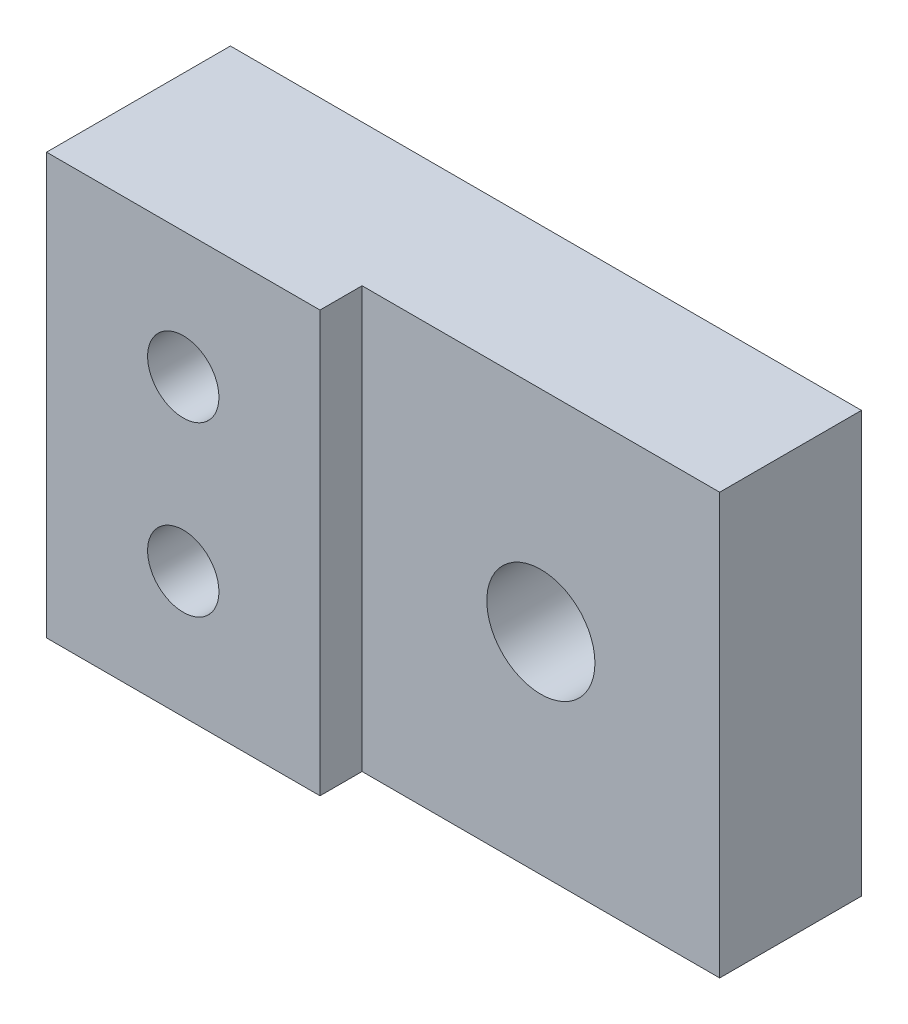
ISO-10303-21;
HEADER;
FILE_DESCRIPTION(('STEP AP214'),'2;1');
FILE_NAME('part.step','',(''),(''),'','','');
FILE_SCHEMA(('AUTOMOTIVE_DESIGN { 1 0 10303 214 1 1 1 1 }'));
ENDSEC;
DATA;
#1=APPLICATION_CONTEXT('core data for automotive mechanical design processes');
#2=APPLICATION_PROTOCOL_DEFINITION('international standard','automotive_design',2000,#1);
#3=PRODUCT_CONTEXT('',#1,'mechanical');
#4=PRODUCT('Part','Part','',(#3));
#5=PRODUCT_RELATED_PRODUCT_CATEGORY('part','',(#4));
#6=PRODUCT_DEFINITION_FORMATION('','',#4);
#7=PRODUCT_DEFINITION_CONTEXT('part definition',#1,'design');
#8=PRODUCT_DEFINITION('design','',#6,#7);
#9=PRODUCT_DEFINITION_SHAPE('','',#8);
#10=(LENGTH_UNIT() NAMED_UNIT(*) SI_UNIT(.MILLI.,.METRE.));
#11=(NAMED_UNIT(*) PLANE_ANGLE_UNIT() SI_UNIT($,.RADIAN.));
#12=(NAMED_UNIT(*) SI_UNIT($,.STERADIAN.) SOLID_ANGLE_UNIT());
#13=UNCERTAINTY_MEASURE_WITH_UNIT(LENGTH_MEASURE(1.E-05),#10,'distance_accuracy_value','');
#14=(GEOMETRIC_REPRESENTATION_CONTEXT(3) GLOBAL_UNCERTAINTY_ASSIGNED_CONTEXT((#13)) GLOBAL_UNIT_ASSIGNED_CONTEXT((#10,
#11,#12)) REPRESENTATION_CONTEXT('',''));
#15=CARTESIAN_POINT('',(0.,0.,0.));
#16=DIRECTION('',(0.,0.,1.));
#17=DIRECTION('',(1.,0.,0.));
#18=AXIS2_PLACEMENT_3D('',#15,#16,#17);
#19=CARTESIAN_POINT('',(0.,26.1112,11.0998));
#20=DIRECTION('',(0.,1.,0.));
#21=DIRECTION('',(0.,0.,1.));
#22=AXIS2_PLACEMENT_3D('',#19,#20,#21);
#23=PLANE('',#22);
#24=DIRECTION('',(1.,0.,0.));
#25=VECTOR('',#24,1.);
#26=CARTESIAN_POINT('',(0.,26.1112,0.));
#27=LINE('',#26,#25);
#28=CARTESIAN_POINT('',(-0.807572599456461,26.1112,0.));
#29=VERTEX_POINT('',#28);
#30=CARTESIAN_POINT('',(37.2924274005435,26.1112,0.));
#31=VERTEX_POINT('',#30);
#32=EDGE_CURVE('E150',#29,#31,#27,.T.);
#33=ORIENTED_EDGE('',*,*,#32,.F.);
#34=DIRECTION('',(0.,0.,-1.));
#35=VECTOR('',#34,1.);
#36=CARTESIAN_POINT('',(-0.807572599456461,26.1112,11.0998));
#37=LINE('',#36,#35);
#38=CARTESIAN_POINT('',(-0.807572599456461,26.1112,11.0998));
#39=VERTEX_POINT('',#38);
#40=EDGE_CURVE('E11',#39,#29,#37,.T.);
#41=ORIENTED_EDGE('',*,*,#40,.F.);
#42=DIRECTION('',(1.,0.,0.));
#43=VECTOR('',#42,1.);
#44=CARTESIAN_POINT('',(0.,26.1112,11.0998));
#45=LINE('',#44,#43);
#46=CARTESIAN_POINT('',(15.7024274005435,26.1112,11.0998));
#47=VERTEX_POINT('',#46);
#48=EDGE_CURVE('E139',#39,#47,#45,.T.);
#49=ORIENTED_EDGE('',*,*,#48,.T.);
#50=DIRECTION('',(0.,0.,-1.));
#51=VECTOR('',#50,1.);
#52=CARTESIAN_POINT('',(15.7024274005435,26.1112,11.0998));
#53=LINE('',#52,#51);
#54=CARTESIAN_POINT('',(15.7024274005435,26.1112,8.5598));
#55=VERTEX_POINT('',#54);
#56=EDGE_CURVE('E65',#47,#55,#53,.T.);
#57=ORIENTED_EDGE('',*,*,#56,.T.);
#58=DIRECTION('',(1.,0.,0.));
#59=VECTOR('',#58,1.);
#60=CARTESIAN_POINT('',(0.,26.1112,8.5598));
#61=LINE('',#60,#59);
#62=CARTESIAN_POINT('',(37.2924274005435,26.1112,8.5598));
#63=VERTEX_POINT('',#62);
#64=EDGE_CURVE('E115',#55,#63,#61,.T.);
#65=ORIENTED_EDGE('',*,*,#64,.T.);
#66=DIRECTION('',(0.,0.,-1.));
#67=VECTOR('',#66,1.);
#68=CARTESIAN_POINT('',(37.2924274005435,26.1112,8.5598));
#69=LINE('',#68,#67);
#70=EDGE_CURVE('E111',#63,#31,#69,.T.);
#71=ORIENTED_EDGE('',*,*,#70,.T.);
#72=EDGE_LOOP('',(#33,#41,#49,#57,#65,#71));
#73=FACE_BOUND('',#72,.T.);
#74=ADVANCED_FACE('F45',(#73),#23,.T.);
#75=CARTESIAN_POINT('',(-0.807572599456461,0.,11.0998));
#76=DIRECTION('',(1.,0.,0.));
#77=DIRECTION('',(0.,1.,0.));
#78=AXIS2_PLACEMENT_3D('',#75,#76,#77);
#79=PLANE('',#78);
#80=DIRECTION('',(0.,-1.,0.));
#81=VECTOR('',#80,1.);
#82=CARTESIAN_POINT('',(-0.807572599456461,0.,0.));
#83=LINE('',#82,#81);
#84=CARTESIAN_POINT('',(-0.807572599456461,0.711199999999999,0.));
#85=VERTEX_POINT('',#84);
#86=EDGE_CURVE('E152',#29,#85,#83,.T.);
#87=ORIENTED_EDGE('',*,*,#86,.T.);
#88=DIRECTION('',(0.,0.,-1.));
#89=VECTOR('',#88,1.);
#90=CARTESIAN_POINT('',(-0.807572599456461,0.711199999999999,11.0998));
#91=LINE('',#90,#89);
#92=CARTESIAN_POINT('',(-0.807572599456461,0.711199999999999,11.0998));
#93=VERTEX_POINT('',#92);
#94=EDGE_CURVE('E53',#93,#85,#91,.T.);
#95=ORIENTED_EDGE('',*,*,#94,.F.);
#96=DIRECTION('',(0.,-1.,0.));
#97=VECTOR('',#96,1.);
#98=CARTESIAN_POINT('',(-0.807572599456461,0.,11.0998));
#99=LINE('',#98,#97);
#100=EDGE_CURVE('E141',#39,#93,#99,.T.);
#101=ORIENTED_EDGE('',*,*,#100,.F.);
#102=ORIENTED_EDGE('',*,*,#40,.T.);
#103=EDGE_LOOP('',(#87,#95,#101,#102));
#104=FACE_BOUND('',#103,.T.);
#105=ADVANCED_FACE('F160',(#104),#79,.F.);
#106=CARTESIAN_POINT('',(0.,0.711199999999999,11.0998));
#107=DIRECTION('',(0.,1.,0.));
#108=DIRECTION('',(0.,0.,1.));
#109=AXIS2_PLACEMENT_3D('',#106,#107,#108);
#110=PLANE('',#109);
#111=DIRECTION('',(1.,0.,0.));
#112=VECTOR('',#111,1.);
#113=CARTESIAN_POINT('',(0.,0.711199999999999,0.));
#114=LINE('',#113,#112);
#115=CARTESIAN_POINT('',(37.2924274005435,0.711199999999999,0.));
#116=VERTEX_POINT('',#115);
#117=EDGE_CURVE('E81',#85,#116,#114,.T.);
#118=ORIENTED_EDGE('',*,*,#117,.T.);
#119=DIRECTION('',(0.,0.,-1.));
#120=VECTOR('',#119,1.);
#121=CARTESIAN_POINT('',(37.2924274005435,0.711199999999999,8.5598));
#122=LINE('',#121,#120);
#123=CARTESIAN_POINT('',(37.2924274005435,0.711199999999999,8.5598));
#124=VERTEX_POINT('',#123);
#125=EDGE_CURVE('E109',#124,#116,#122,.T.);
#126=ORIENTED_EDGE('',*,*,#125,.F.);
#127=DIRECTION('',(1.,0.,0.));
#128=VECTOR('',#127,1.);
#129=CARTESIAN_POINT('',(0.,0.711199999999999,8.5598));
#130=LINE('',#129,#128);
#131=CARTESIAN_POINT('',(15.7024274005435,0.711199999999995,8.5598));
#132=VERTEX_POINT('',#131);
#133=EDGE_CURVE('E116',#132,#124,#130,.T.);
#134=ORIENTED_EDGE('',*,*,#133,.F.);
#135=DIRECTION('',(0.,0.,-1.));
#136=VECTOR('',#135,1.);
#137=CARTESIAN_POINT('',(15.7024274005435,0.711199999999995,11.0998));
#138=LINE('',#137,#136);
#139=CARTESIAN_POINT('',(15.7024274005435,0.711199999999995,11.0998));
#140=VERTEX_POINT('',#139);
#141=EDGE_CURVE('E157',#140,#132,#138,.T.);
#142=ORIENTED_EDGE('',*,*,#141,.F.);
#143=DIRECTION('',(1.,0.,0.));
#144=VECTOR('',#143,1.);
#145=CARTESIAN_POINT('',(0.,0.711199999999999,11.0998));
#146=LINE('',#145,#144);
#147=EDGE_CURVE('E144',#93,#140,#146,.T.);
#148=ORIENTED_EDGE('',*,*,#147,.F.);
#149=ORIENTED_EDGE('',*,*,#94,.T.);
#150=EDGE_LOOP('',(#118,#126,#134,#142,#148,#149));
#151=FACE_BOUND('',#150,.T.);
#152=ADVANCED_FACE('F124',(#151),#110,.F.);
#153=CARTESIAN_POINT('',(7.44742740054354,8.3312,11.0998));
#154=DIRECTION('',(0.,0.,-1.));
#155=DIRECTION('',(-1.,0.,0.));
#156=AXIS2_PLACEMENT_3D('',#153,#154,#155);
#157=CYLINDRICAL_SURFACE('',#156,2.15265);
#158=CARTESIAN_POINT('',(7.44742740054354,8.3312,11.0998));
#159=DIRECTION('',(0.,0.,1.));
#160=DIRECTION('',(1.,0.,0.));
#161=AXIS2_PLACEMENT_3D('',#158,#159,#160);
#162=CIRCLE('',#161,2.15265);
#163=CARTESIAN_POINT('',(9.60007740054354,8.3312,11.0998));
#164=VERTEX_POINT('',#163);
#165=EDGE_CURVE('E136',#164,#164,#162,.T.);
#166=ORIENTED_EDGE('',*,*,#165,.T.);
#167=EDGE_LOOP('',(#166));
#168=FACE_BOUND('',#167,.T.);
#169=CARTESIAN_POINT('',(7.44742740054354,8.3312,0.));
#170=DIRECTION('',(0.,0.,1.));
#171=DIRECTION('',(1.,0.,0.));
#172=AXIS2_PLACEMENT_3D('',#169,#170,#171);
#173=CIRCLE('',#172,2.15265);
#174=CARTESIAN_POINT('',(9.60007740054354,8.3312,0.));
#175=VERTEX_POINT('',#174);
#176=EDGE_CURVE('E128',#175,#175,#173,.T.);
#177=ORIENTED_EDGE('',*,*,#176,.F.);
#178=EDGE_LOOP('',(#177));
#179=FACE_BOUND('',#178,.T.);
#180=ADVANCED_FACE('F194',(#168,#179),#157,.F.);
#181=CARTESIAN_POINT('',(7.44742740054354,18.4912,11.0998));
#182=DIRECTION('',(0.,0.,-1.));
#183=DIRECTION('',(-1.,0.,0.));
#184=AXIS2_PLACEMENT_3D('',#181,#182,#183);
#185=CYLINDRICAL_SURFACE('',#184,2.15265);
#186=CARTESIAN_POINT('',(7.44742740054354,18.4912,11.0998));
#187=DIRECTION('',(0.,0.,1.));
#188=DIRECTION('',(1.,0.,0.));
#189=AXIS2_PLACEMENT_3D('',#186,#187,#188);
#190=CIRCLE('',#189,2.15265);
#191=CARTESIAN_POINT('',(9.60007740054354,18.4912,11.0998));
#192=VERTEX_POINT('',#191);
#193=EDGE_CURVE('E133',#192,#192,#190,.T.);
#194=ORIENTED_EDGE('',*,*,#193,.T.);
#195=EDGE_LOOP('',(#194));
#196=FACE_BOUND('',#195,.T.);
#197=CARTESIAN_POINT('',(7.44742740054354,18.4912,0.));
#198=DIRECTION('',(0.,0.,1.));
#199=DIRECTION('',(1.,0.,0.));
#200=AXIS2_PLACEMENT_3D('',#197,#198,#199);
#201=CIRCLE('',#200,2.15265);
#202=CARTESIAN_POINT('',(9.60007740054354,18.4912,0.));
#203=VERTEX_POINT('',#202);
#204=EDGE_CURVE('E125',#203,#203,#201,.T.);
#205=ORIENTED_EDGE('',*,*,#204,.F.);
#206=EDGE_LOOP('',(#205));
#207=FACE_BOUND('',#206,.T.);
#208=ADVANCED_FACE('F47',(#196,#207),#185,.F.);
#209=CARTESIAN_POINT('',(15.7024274005435,0.,11.0998));
#210=DIRECTION('',(1.,0.,0.));
#211=DIRECTION('',(0.,1.,0.));
#212=AXIS2_PLACEMENT_3D('',#209,#210,#211);
#213=PLANE('',#212);
#214=DIRECTION('',(0.,-1.,0.));
#215=VECTOR('',#214,1.);
#216=CARTESIAN_POINT('',(15.7024274005435,0.,8.5598));
#217=LINE('',#216,#215);
#218=EDGE_CURVE('E60',#55,#132,#217,.T.);
#219=ORIENTED_EDGE('',*,*,#218,.F.);
#220=ORIENTED_EDGE('',*,*,#56,.F.);
#221=DIRECTION('',(0.,-1.,0.));
#222=VECTOR('',#221,1.);
#223=CARTESIAN_POINT('',(15.7024274005435,0.,11.0998));
#224=LINE('',#223,#222);
#225=EDGE_CURVE('E146',#47,#140,#224,.T.);
#226=ORIENTED_EDGE('',*,*,#225,.T.);
#227=ORIENTED_EDGE('',*,*,#141,.T.);
#228=EDGE_LOOP('',(#219,#220,#226,#227));
#229=FACE_BOUND('',#228,.T.);
#230=ADVANCED_FACE('F200',(#229),#213,.T.);
#231=CARTESIAN_POINT('',(0.,0.,11.0998));
#232=DIRECTION('',(0.,0.,1.));
#233=DIRECTION('',(1.,0.,0.));
#234=AXIS2_PLACEMENT_3D('',#231,#232,#233);
#235=PLANE('',#234);
#236=ORIENTED_EDGE('',*,*,#193,.F.);
#237=EDGE_LOOP('',(#236));
#238=FACE_BOUND('',#237,.T.);
#239=ORIENTED_EDGE('',*,*,#165,.F.);
#240=EDGE_LOOP('',(#239));
#241=FACE_BOUND('',#240,.T.);
#242=ORIENTED_EDGE('',*,*,#48,.F.);
#243=ORIENTED_EDGE('',*,*,#100,.T.);
#244=ORIENTED_EDGE('',*,*,#147,.T.);
#245=ORIENTED_EDGE('',*,*,#225,.F.);
#246=EDGE_LOOP('',(#242,#243,#244,#245));
#247=FACE_BOUND('',#246,.T.);
#248=ADVANCED_FACE('F207',(#238,#241,#247),#235,.T.);
#249=CARTESIAN_POINT('',(0.,0.,0.));
#250=DIRECTION('',(0.,0.,1.));
#251=DIRECTION('',(1.,0.,0.));
#252=AXIS2_PLACEMENT_3D('',#249,#250,#251);
#253=PLANE('',#252);
#254=ORIENTED_EDGE('',*,*,#204,.T.);
#255=EDGE_LOOP('',(#254));
#256=FACE_BOUND('',#255,.T.);
#257=ORIENTED_EDGE('',*,*,#176,.T.);
#258=EDGE_LOOP('',(#257));
#259=FACE_BOUND('',#258,.T.);
#260=ORIENTED_EDGE('',*,*,#32,.T.);
#261=DIRECTION('',(0.,1.,0.));
#262=VECTOR('',#261,1.);
#263=CARTESIAN_POINT('',(37.2924274005435,0.,0.));
#264=LINE('',#263,#262);
#265=EDGE_CURVE('E163',#116,#31,#264,.T.);
#266=ORIENTED_EDGE('',*,*,#265,.F.);
#267=ORIENTED_EDGE('',*,*,#117,.F.);
#268=ORIENTED_EDGE('',*,*,#86,.F.);
#269=EDGE_LOOP('',(#260,#266,#267,#268));
#270=FACE_BOUND('',#269,.T.);
#271=CARTESIAN_POINT('',(26.4974274005435,13.4112,0.));
#272=DIRECTION('',(0.,0.,1.));
#273=DIRECTION('',(1.,0.,0.));
#274=AXIS2_PLACEMENT_3D('',#271,#272,#273);
#275=CIRCLE('',#274,3.2639);
#276=CARTESIAN_POINT('',(29.7613274005435,13.4112,0.));
#277=VERTEX_POINT('',#276);
#278=EDGE_CURVE('E164',#277,#277,#275,.T.);
#279=ORIENTED_EDGE('',*,*,#278,.T.);
#280=EDGE_LOOP('',(#279));
#281=FACE_BOUND('',#280,.T.);
#282=ADVANCED_FACE('F161',(#256,#259,#270,#281),#253,.F.);
#283=CARTESIAN_POINT('',(37.2924274005435,0.,8.5598));
#284=DIRECTION('',(-1.,0.,0.));
#285=DIRECTION('',(0.,0.,1.));
#286=AXIS2_PLACEMENT_3D('',#283,#284,#285);
#287=PLANE('',#286);
#288=ORIENTED_EDGE('',*,*,#265,.T.);
#289=ORIENTED_EDGE('',*,*,#70,.F.);
#290=DIRECTION('',(0.,1.,0.));
#291=VECTOR('',#290,1.);
#292=CARTESIAN_POINT('',(37.2924274005435,0.,8.5598));
#293=LINE('',#292,#291);
#294=EDGE_CURVE('E104',#124,#63,#293,.T.);
#295=ORIENTED_EDGE('',*,*,#294,.F.);
#296=ORIENTED_EDGE('',*,*,#125,.T.);
#297=EDGE_LOOP('',(#288,#289,#295,#296));
#298=FACE_BOUND('',#297,.T.);
#299=ADVANCED_FACE('F107',(#298),#287,.F.);
#300=CARTESIAN_POINT('',(26.4974274005435,13.4112,8.5598));
#301=DIRECTION('',(0.,0.,-1.));
#302=DIRECTION('',(-1.,0.,0.));
#303=AXIS2_PLACEMENT_3D('',#300,#301,#302);
#304=CYLINDRICAL_SURFACE('',#303,3.2639);
#305=CARTESIAN_POINT('',(26.4974274005435,13.4112,8.5598));
#306=DIRECTION('',(0.,0.,1.));
#307=DIRECTION('',(1.,0.,0.));
#308=AXIS2_PLACEMENT_3D('',#305,#306,#307);
#309=CIRCLE('',#308,3.2639);
#310=CARTESIAN_POINT('',(29.7613274005435,13.4112,8.5598));
#311=VERTEX_POINT('',#310);
#312=EDGE_CURVE('E122',#311,#311,#309,.T.);
#313=ORIENTED_EDGE('',*,*,#312,.T.);
#314=EDGE_LOOP('',(#313));
#315=FACE_BOUND('',#314,.T.);
#316=ORIENTED_EDGE('',*,*,#278,.F.);
#317=EDGE_LOOP('',(#316));
#318=FACE_BOUND('',#317,.T.);
#319=ADVANCED_FACE('F173',(#315,#318),#304,.F.);
#320=CARTESIAN_POINT('',(0.,0.,8.5598));
#321=DIRECTION('',(0.,0.,1.));
#322=DIRECTION('',(1.,0.,0.));
#323=AXIS2_PLACEMENT_3D('',#320,#321,#322);
#324=PLANE('',#323);
#325=ORIENTED_EDGE('',*,*,#312,.F.);
#326=EDGE_LOOP('',(#325));
#327=FACE_BOUND('',#326,.T.);
#328=ORIENTED_EDGE('',*,*,#133,.T.);
#329=ORIENTED_EDGE('',*,*,#294,.T.);
#330=ORIENTED_EDGE('',*,*,#64,.F.);
#331=ORIENTED_EDGE('',*,*,#218,.T.);
#332=EDGE_LOOP('',(#328,#329,#330,#331));
#333=FACE_BOUND('',#332,.T.);
#334=ADVANCED_FACE('F119',(#327,#333),#324,.T.);
#335=CLOSED_SHELL('',(#74,#105,#152,#180,#208,#230,#248,#282,#299,#319,#334));
#336=MANIFOLD_SOLID_BREP('B2',#335);
#337=ADVANCED_BREP_SHAPE_REPRESENTATION('',(#18,#336),#14);
#338=SHAPE_DEFINITION_REPRESENTATION(#9,#337);
ENDSEC;
END-ISO-10303-21;
